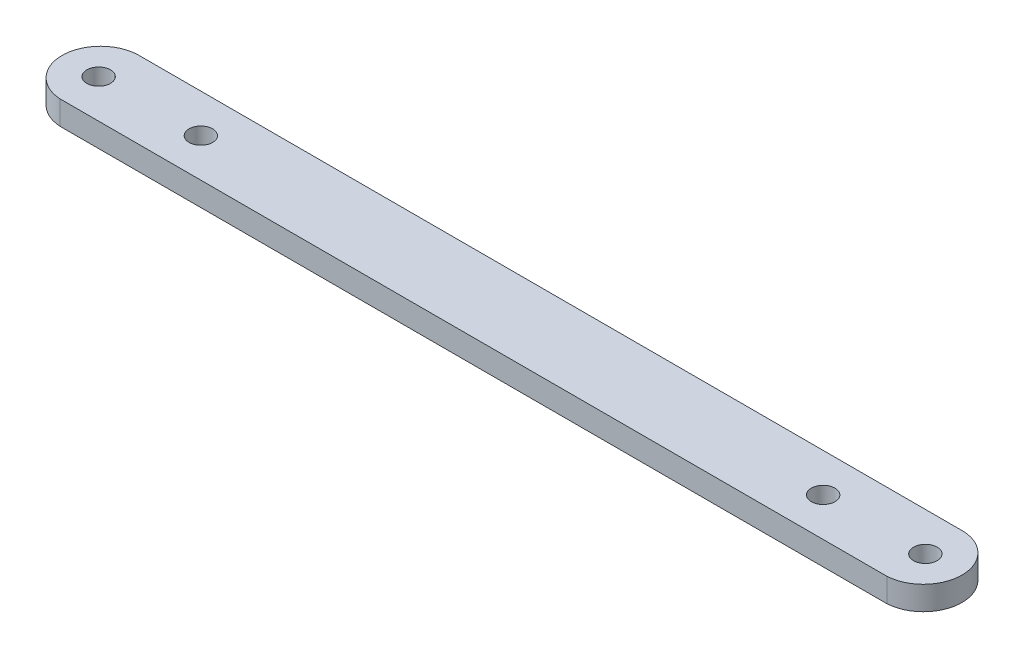
ISO-10303-21;
HEADER;
FILE_DESCRIPTION(('STEP AP214'),'2;1');
FILE_NAME('part.step','',(''),(''),'','','');
FILE_SCHEMA(('AUTOMOTIVE_DESIGN { 1 0 10303 214 1 1 1 1 }'));
ENDSEC;
DATA;
#1=APPLICATION_CONTEXT('core data for automotive mechanical design processes');
#2=APPLICATION_PROTOCOL_DEFINITION('international standard','automotive_design',2000,#1);
#3=PRODUCT_CONTEXT('',#1,'mechanical');
#4=PRODUCT('Part','Part','',(#3));
#5=PRODUCT_RELATED_PRODUCT_CATEGORY('part','',(#4));
#6=PRODUCT_DEFINITION_FORMATION('','',#4);
#7=PRODUCT_DEFINITION_CONTEXT('part definition',#1,'design');
#8=PRODUCT_DEFINITION('design','',#6,#7);
#9=PRODUCT_DEFINITION_SHAPE('','',#8);
#10=(LENGTH_UNIT() NAMED_UNIT(*) SI_UNIT(.MILLI.,.METRE.));
#11=(NAMED_UNIT(*) PLANE_ANGLE_UNIT() SI_UNIT($,.RADIAN.));
#12=(NAMED_UNIT(*) SI_UNIT($,.STERADIAN.) SOLID_ANGLE_UNIT());
#13=UNCERTAINTY_MEASURE_WITH_UNIT(LENGTH_MEASURE(1.E-05),#10,'distance_accuracy_value','');
#14=(GEOMETRIC_REPRESENTATION_CONTEXT(3) GLOBAL_UNCERTAINTY_ASSIGNED_CONTEXT((#13)) GLOBAL_UNIT_ASSIGNED_CONTEXT((#10,
#11,#12)) REPRESENTATION_CONTEXT('',''));
#15=CARTESIAN_POINT('',(0.,0.,0.));
#16=DIRECTION('',(0.,0.,1.));
#17=DIRECTION('',(1.,0.,0.));
#18=AXIS2_PLACEMENT_3D('',#15,#16,#17);
#19=CARTESIAN_POINT('',(-63.9921052631579,3.7,0.));
#20=DIRECTION('',(0.,1.,0.));
#21=DIRECTION('',(0.,0.,1.));
#22=AXIS2_PLACEMENT_3D('',#19,#20,#21);
#23=PLANE('',#22);
#24=CARTESIAN_POINT('',(64.3,3.7,0.));
#25=DIRECTION('',(0.,1.,0.));
#26=DIRECTION('',(0.,0.,-1.));
#27=AXIS2_PLACEMENT_3D('',#24,#25,#26);
#28=CIRCLE('',#27,1.835);
#29=CARTESIAN_POINT('',(64.3,3.7,-1.835));
#30=VERTEX_POINT('',#29);
#31=EDGE_CURVE('E146',#30,#30,#28,.T.);
#32=ORIENTED_EDGE('',*,*,#31,.F.);
#33=EDGE_LOOP('',(#32));
#34=FACE_BOUND('',#33,.T.);
#35=CARTESIAN_POINT('',(-64.3,3.7,0.));
#36=DIRECTION('',(0.,1.,0.));
#37=DIRECTION('',(0.,0.,1.));
#38=AXIS2_PLACEMENT_3D('',#35,#36,#37);
#39=CIRCLE('',#38,1.835);
#40=CARTESIAN_POINT('',(-64.3,3.7,1.835));
#41=VERTEX_POINT('',#40);
#42=EDGE_CURVE('E116',#41,#41,#39,.T.);
#43=ORIENTED_EDGE('',*,*,#42,.F.);
#44=EDGE_LOOP('',(#43));
#45=FACE_BOUND('',#44,.T.);
#46=CARTESIAN_POINT('',(-63.9921052631579,3.7,0.));
#47=DIRECTION('',(0.,1.,0.));
#48=DIRECTION('',(0.,0.,1.));
#49=AXIS2_PLACEMENT_3D('',#46,#47,#48);
#50=CIRCLE('',#49,6.0078947368421);
#51=CARTESIAN_POINT('',(-64.3,3.7,-5.99999999999999));
#52=VERTEX_POINT('',#51);
#53=CARTESIAN_POINT('',(-64.3,3.7,6.00000000000001));
#54=VERTEX_POINT('',#53);
#55=EDGE_CURVE('E96',#52,#54,#50,.T.);
#56=ORIENTED_EDGE('',*,*,#55,.T.);
#57=DIRECTION('',(1.,0.,0.));
#58=VECTOR('',#57,1.);
#59=CARTESIAN_POINT('',(-64.3,3.7,6.00000000000001));
#60=LINE('',#59,#58);
#61=CARTESIAN_POINT('',(64.3,3.7,5.99999999999999));
#62=VERTEX_POINT('',#61);
#63=EDGE_CURVE('E91',#54,#62,#60,.T.);
#64=ORIENTED_EDGE('',*,*,#63,.T.);
#65=CARTESIAN_POINT('',(63.9921052631579,3.7,0.));
#66=DIRECTION('',(0.,1.,0.));
#67=DIRECTION('',(0.,0.,-1.));
#68=AXIS2_PLACEMENT_3D('',#65,#66,#67);
#69=CIRCLE('',#68,6.0078947368421);
#70=CARTESIAN_POINT('',(64.3,3.7,-6.00000000000001));
#71=VERTEX_POINT('',#70);
#72=EDGE_CURVE('E94',#62,#71,#69,.T.);
#73=ORIENTED_EDGE('',*,*,#72,.T.);
#74=DIRECTION('',(-1.,0.,0.));
#75=VECTOR('',#74,1.);
#76=CARTESIAN_POINT('',(-64.3,3.7,-5.99999999999999));
#77=LINE('',#76,#75);
#78=EDGE_CURVE('E61',#71,#52,#77,.T.);
#79=ORIENTED_EDGE('',*,*,#78,.T.);
#80=EDGE_LOOP('',(#56,#64,#73,#79));
#81=FACE_BOUND('',#80,.T.);
#82=CARTESIAN_POINT('',(-48.4,3.7,0.));
#83=DIRECTION('',(0.,1.,0.));
#84=DIRECTION('',(0.,0.,1.));
#85=AXIS2_PLACEMENT_3D('',#82,#83,#84);
#86=CIRCLE('',#85,1.835);
#87=CARTESIAN_POINT('',(-48.4,3.7,1.835));
#88=VERTEX_POINT('',#87);
#89=EDGE_CURVE('E138',#88,#88,#86,.T.);
#90=ORIENTED_EDGE('',*,*,#89,.F.);
#91=EDGE_LOOP('',(#90));
#92=FACE_BOUND('',#91,.T.);
#93=CARTESIAN_POINT('',(48.4,3.7,0.));
#94=DIRECTION('',(0.,1.,0.));
#95=DIRECTION('',(0.,0.,-1.));
#96=AXIS2_PLACEMENT_3D('',#93,#94,#95);
#97=CIRCLE('',#96,1.835);
#98=CARTESIAN_POINT('',(48.4,3.7,-1.835));
#99=VERTEX_POINT('',#98);
#100=EDGE_CURVE('E154',#99,#99,#97,.T.);
#101=ORIENTED_EDGE('',*,*,#100,.F.);
#102=EDGE_LOOP('',(#101));
#103=FACE_BOUND('',#102,.T.);
#104=ADVANCED_FACE('F43',(#34,#45,#81,#92,#103),#23,.T.);
#105=CARTESIAN_POINT('',(-63.9921052631579,0.,0.));
#106=DIRECTION('',(0.,1.,0.));
#107=DIRECTION('',(0.,0.,1.));
#108=AXIS2_PLACEMENT_3D('',#105,#106,#107);
#109=PLANE('',#108);
#110=CARTESIAN_POINT('',(-63.9921052631579,0.,0.));
#111=DIRECTION('',(0.,1.,0.));
#112=DIRECTION('',(0.,0.,1.));
#113=AXIS2_PLACEMENT_3D('',#110,#111,#112);
#114=CIRCLE('',#113,6.0078947368421);
#115=CARTESIAN_POINT('',(-64.3,0.,-5.99999999999999));
#116=VERTEX_POINT('',#115);
#117=CARTESIAN_POINT('',(-64.3,0.,6.00000000000001));
#118=VERTEX_POINT('',#117);
#119=EDGE_CURVE('E112',#116,#118,#114,.T.);
#120=ORIENTED_EDGE('',*,*,#119,.F.);
#121=DIRECTION('',(-1.,0.,0.));
#122=VECTOR('',#121,1.);
#123=CARTESIAN_POINT('',(-64.3,0.,-5.99999999999999));
#124=LINE('',#123,#122);
#125=CARTESIAN_POINT('',(64.3,0.,-6.00000000000001));
#126=VERTEX_POINT('',#125);
#127=EDGE_CURVE('E84',#126,#116,#124,.T.);
#128=ORIENTED_EDGE('',*,*,#127,.F.);
#129=CARTESIAN_POINT('',(63.9921052631579,0.,0.));
#130=DIRECTION('',(0.,1.,0.));
#131=DIRECTION('',(0.,0.,-1.));
#132=AXIS2_PLACEMENT_3D('',#129,#130,#131);
#133=CIRCLE('',#132,6.0078947368421);
#134=CARTESIAN_POINT('',(64.3,0.,5.99999999999999));
#135=VERTEX_POINT('',#134);
#136=EDGE_CURVE('E78',#135,#126,#133,.T.);
#137=ORIENTED_EDGE('',*,*,#136,.F.);
#138=DIRECTION('',(1.,0.,0.));
#139=VECTOR('',#138,1.);
#140=CARTESIAN_POINT('',(-64.3,0.,6.00000000000001));
#141=LINE('',#140,#139);
#142=EDGE_CURVE('E101',#118,#135,#141,.T.);
#143=ORIENTED_EDGE('',*,*,#142,.F.);
#144=EDGE_LOOP('',(#120,#128,#137,#143));
#145=FACE_BOUND('',#144,.T.);
#146=CARTESIAN_POINT('',(-64.3,0.,0.));
#147=DIRECTION('',(0.,1.,0.));
#148=DIRECTION('',(0.,0.,1.));
#149=AXIS2_PLACEMENT_3D('',#146,#147,#148);
#150=CIRCLE('',#149,1.835);
#151=CARTESIAN_POINT('',(-64.3,0.,1.835));
#152=VERTEX_POINT('',#151);
#153=EDGE_CURVE('E134',#152,#152,#150,.T.);
#154=ORIENTED_EDGE('',*,*,#153,.T.);
#155=EDGE_LOOP('',(#154));
#156=FACE_BOUND('',#155,.T.);
#157=CARTESIAN_POINT('',(-48.4,0.,0.));
#158=DIRECTION('',(0.,1.,0.));
#159=DIRECTION('',(0.,0.,1.));
#160=AXIS2_PLACEMENT_3D('',#157,#158,#159);
#161=CIRCLE('',#160,1.835);
#162=CARTESIAN_POINT('',(-48.4,0.,1.835));
#163=VERTEX_POINT('',#162);
#164=EDGE_CURVE('E142',#163,#163,#161,.T.);
#165=ORIENTED_EDGE('',*,*,#164,.T.);
#166=EDGE_LOOP('',(#165));
#167=FACE_BOUND('',#166,.T.);
#168=CARTESIAN_POINT('',(64.3,0.,0.));
#169=DIRECTION('',(0.,1.,0.));
#170=DIRECTION('',(0.,0.,-1.));
#171=AXIS2_PLACEMENT_3D('',#168,#169,#170);
#172=CIRCLE('',#171,1.835);
#173=CARTESIAN_POINT('',(64.3,0.,-1.835));
#174=VERTEX_POINT('',#173);
#175=EDGE_CURVE('E150',#174,#174,#172,.T.);
#176=ORIENTED_EDGE('',*,*,#175,.T.);
#177=EDGE_LOOP('',(#176));
#178=FACE_BOUND('',#177,.T.);
#179=CARTESIAN_POINT('',(48.4,0.,0.));
#180=DIRECTION('',(0.,1.,0.));
#181=DIRECTION('',(0.,0.,-1.));
#182=AXIS2_PLACEMENT_3D('',#179,#180,#181);
#183=CIRCLE('',#182,1.835);
#184=CARTESIAN_POINT('',(48.4,0.,-1.835));
#185=VERTEX_POINT('',#184);
#186=EDGE_CURVE('E158',#185,#185,#183,.T.);
#187=ORIENTED_EDGE('',*,*,#186,.T.);
#188=EDGE_LOOP('',(#187));
#189=FACE_BOUND('',#188,.T.);
#190=ADVANCED_FACE('F129',(#145,#156,#167,#178,#189),#109,.F.);
#191=CARTESIAN_POINT('',(-63.9921052631579,3.7,0.));
#192=DIRECTION('',(0.,-1.,0.));
#193=DIRECTION('',(0.,0.,-1.));
#194=AXIS2_PLACEMENT_3D('',#191,#192,#193);
#195=CYLINDRICAL_SURFACE('',#194,6.0078947368421);
#196=ORIENTED_EDGE('',*,*,#119,.T.);
#197=DIRECTION('',(0.,-1.,0.));
#198=VECTOR('',#197,1.);
#199=CARTESIAN_POINT('',(-64.3,3.7,6.00000000000001));
#200=LINE('',#199,#198);
#201=EDGE_CURVE('E11',#54,#118,#200,.T.);
#202=ORIENTED_EDGE('',*,*,#201,.F.);
#203=ORIENTED_EDGE('',*,*,#55,.F.);
#204=DIRECTION('',(0.,-1.,0.));
#205=VECTOR('',#204,1.);
#206=CARTESIAN_POINT('',(-64.3,3.7,-5.99999999999999));
#207=LINE('',#206,#205);
#208=EDGE_CURVE('E108',#52,#116,#207,.T.);
#209=ORIENTED_EDGE('',*,*,#208,.T.);
#210=EDGE_LOOP('',(#196,#202,#203,#209));
#211=FACE_BOUND('',#210,.T.);
#212=ADVANCED_FACE('F45',(#211),#195,.T.);
#213=CARTESIAN_POINT('',(-64.3,3.7,6.00000000000001));
#214=DIRECTION('',(0.,0.,-1.));
#215=DIRECTION('',(-1.,0.,0.));
#216=AXIS2_PLACEMENT_3D('',#213,#214,#215);
#217=PLANE('',#216);
#218=ORIENTED_EDGE('',*,*,#142,.T.);
#219=DIRECTION('',(0.,-1.,0.));
#220=VECTOR('',#219,1.);
#221=CARTESIAN_POINT('',(64.3,3.7,5.99999999999999));
#222=LINE('',#221,#220);
#223=EDGE_CURVE('E53',#62,#135,#222,.T.);
#224=ORIENTED_EDGE('',*,*,#223,.F.);
#225=ORIENTED_EDGE('',*,*,#63,.F.);
#226=ORIENTED_EDGE('',*,*,#201,.T.);
#227=EDGE_LOOP('',(#218,#224,#225,#226));
#228=FACE_BOUND('',#227,.T.);
#229=ADVANCED_FACE('F100',(#228),#217,.F.);
#230=CARTESIAN_POINT('',(63.9921052631579,3.7,0.));
#231=DIRECTION('',(0.,-1.,0.));
#232=DIRECTION('',(0.,0.,-1.));
#233=AXIS2_PLACEMENT_3D('',#230,#231,#232);
#234=CYLINDRICAL_SURFACE('',#233,6.0078947368421);
#235=ORIENTED_EDGE('',*,*,#136,.T.);
#236=DIRECTION('',(0.,-1.,0.));
#237=VECTOR('',#236,1.);
#238=CARTESIAN_POINT('',(64.3,3.7,-6.00000000000001));
#239=LINE('',#238,#237);
#240=EDGE_CURVE('E103',#71,#126,#239,.T.);
#241=ORIENTED_EDGE('',*,*,#240,.F.);
#242=ORIENTED_EDGE('',*,*,#72,.F.);
#243=ORIENTED_EDGE('',*,*,#223,.T.);
#244=EDGE_LOOP('',(#235,#241,#242,#243));
#245=FACE_BOUND('',#244,.T.);
#246=ADVANCED_FACE('F104',(#245),#234,.T.);
#247=CARTESIAN_POINT('',(-64.3,3.7,-5.99999999999999));
#248=DIRECTION('',(0.,0.,1.));
#249=DIRECTION('',(1.,0.,0.));
#250=AXIS2_PLACEMENT_3D('',#247,#248,#249);
#251=PLANE('',#250);
#252=ORIENTED_EDGE('',*,*,#127,.T.);
#253=ORIENTED_EDGE('',*,*,#208,.F.);
#254=ORIENTED_EDGE('',*,*,#78,.F.);
#255=ORIENTED_EDGE('',*,*,#240,.T.);
#256=EDGE_LOOP('',(#252,#253,#254,#255));
#257=FACE_BOUND('',#256,.T.);
#258=ADVANCED_FACE('F126',(#257),#251,.F.);
#259=CARTESIAN_POINT('',(-64.3,3.7,0.));
#260=DIRECTION('',(0.,-1.,0.));
#261=DIRECTION('',(0.,0.,-1.));
#262=AXIS2_PLACEMENT_3D('',#259,#260,#261);
#263=CYLINDRICAL_SURFACE('',#262,1.835);
#264=ORIENTED_EDGE('',*,*,#42,.T.);
#265=EDGE_LOOP('',(#264));
#266=FACE_BOUND('',#265,.T.);
#267=ORIENTED_EDGE('',*,*,#153,.F.);
#268=EDGE_LOOP('',(#267));
#269=FACE_BOUND('',#268,.T.);
#270=ADVANCED_FACE('F179',(#266,#269),#263,.F.);
#271=CARTESIAN_POINT('',(-48.4,3.7,0.));
#272=DIRECTION('',(0.,-1.,0.));
#273=DIRECTION('',(0.,0.,-1.));
#274=AXIS2_PLACEMENT_3D('',#271,#272,#273);
#275=CYLINDRICAL_SURFACE('',#274,1.835);
#276=ORIENTED_EDGE('',*,*,#89,.T.);
#277=EDGE_LOOP('',(#276));
#278=FACE_BOUND('',#277,.T.);
#279=ORIENTED_EDGE('',*,*,#164,.F.);
#280=EDGE_LOOP('',(#279));
#281=FACE_BOUND('',#280,.T.);
#282=ADVANCED_FACE('F233',(#278,#281),#275,.F.);
#283=CARTESIAN_POINT('',(64.3,3.7,0.));
#284=DIRECTION('',(0.,-1.,0.));
#285=DIRECTION('',(0.,0.,-1.));
#286=AXIS2_PLACEMENT_3D('',#283,#284,#285);
#287=CYLINDRICAL_SURFACE('',#286,1.835);
#288=ORIENTED_EDGE('',*,*,#31,.T.);
#289=EDGE_LOOP('',(#288));
#290=FACE_BOUND('',#289,.T.);
#291=ORIENTED_EDGE('',*,*,#175,.F.);
#292=EDGE_LOOP('',(#291));
#293=FACE_BOUND('',#292,.T.);
#294=ADVANCED_FACE('F242',(#290,#293),#287,.F.);
#295=CARTESIAN_POINT('',(48.4,3.7,0.));
#296=DIRECTION('',(0.,-1.,0.));
#297=DIRECTION('',(0.,0.,-1.));
#298=AXIS2_PLACEMENT_3D('',#295,#296,#297);
#299=CYLINDRICAL_SURFACE('',#298,1.835);
#300=ORIENTED_EDGE('',*,*,#100,.T.);
#301=EDGE_LOOP('',(#300));
#302=FACE_BOUND('',#301,.T.);
#303=ORIENTED_EDGE('',*,*,#186,.F.);
#304=EDGE_LOOP('',(#303));
#305=FACE_BOUND('',#304,.T.);
#306=ADVANCED_FACE('F166',(#302,#305),#299,.F.);
#307=CLOSED_SHELL('',(#104,#190,#212,#229,#246,#258,#270,#282,#294,#306));
#308=MANIFOLD_SOLID_BREP('B2',#307);
#309=ADVANCED_BREP_SHAPE_REPRESENTATION('',(#18,#308),#14);
#310=SHAPE_DEFINITION_REPRESENTATION(#9,#309);
ENDSEC;
END-ISO-10303-21;
